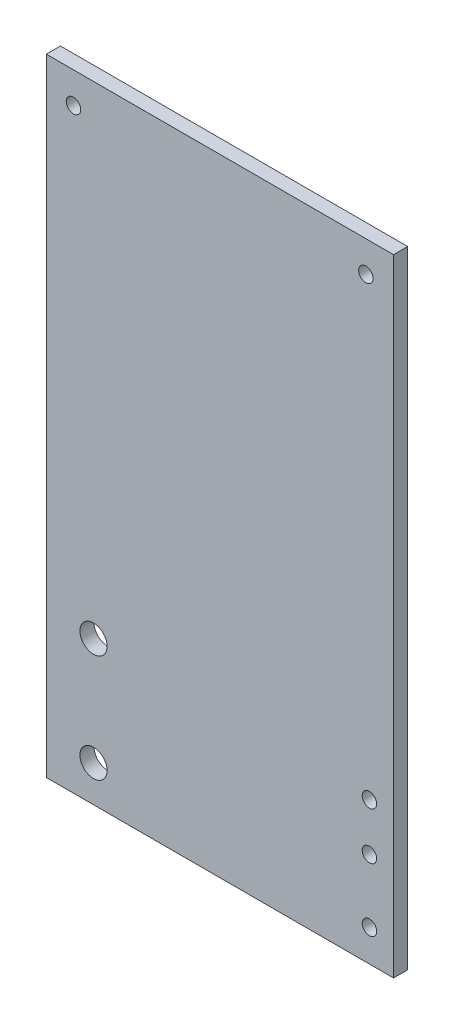
ISO-10303-21;
HEADER;
FILE_DESCRIPTION(('STEP AP214'),'2;1');
FILE_NAME('part.step','',(''),(''),'','','');
FILE_SCHEMA(('AUTOMOTIVE_DESIGN { 1 0 10303 214 1 1 1 1 }'));
ENDSEC;
DATA;
#1=APPLICATION_CONTEXT('core data for automotive mechanical design processes');
#2=APPLICATION_PROTOCOL_DEFINITION('international standard','automotive_design',2000,#1);
#3=PRODUCT_CONTEXT('',#1,'mechanical');
#4=PRODUCT('Part','Part','',(#3));
#5=PRODUCT_RELATED_PRODUCT_CATEGORY('part','',(#4));
#6=PRODUCT_DEFINITION_FORMATION('','',#4);
#7=PRODUCT_DEFINITION_CONTEXT('part definition',#1,'design');
#8=PRODUCT_DEFINITION('design','',#6,#7);
#9=PRODUCT_DEFINITION_SHAPE('','',#8);
#10=(LENGTH_UNIT() NAMED_UNIT(*) SI_UNIT(.MILLI.,.METRE.));
#11=(NAMED_UNIT(*) PLANE_ANGLE_UNIT() SI_UNIT($,.RADIAN.));
#12=(NAMED_UNIT(*) SI_UNIT($,.STERADIAN.) SOLID_ANGLE_UNIT());
#13=UNCERTAINTY_MEASURE_WITH_UNIT(LENGTH_MEASURE(1.E-05),#10,'distance_accuracy_value','');
#14=(GEOMETRIC_REPRESENTATION_CONTEXT(3) GLOBAL_UNCERTAINTY_ASSIGNED_CONTEXT((#13)) GLOBAL_UNIT_ASSIGNED_CONTEXT((#10,
#11,#12)) REPRESENTATION_CONTEXT('',''));
#15=CARTESIAN_POINT('',(0.,0.,0.));
#16=DIRECTION('',(0.,0.,1.));
#17=DIRECTION('',(1.,0.,0.));
#18=AXIS2_PLACEMENT_3D('',#15,#16,#17);
#19=CARTESIAN_POINT('',(19.43,0.,0.79));
#20=DIRECTION('',(0.,1.,0.));
#21=DIRECTION('',(0.,0.,1.));
#22=AXIS2_PLACEMENT_3D('',#19,#20,#21);
#23=PLANE('',#22);
#24=DIRECTION('',(1.,0.,0.));
#25=VECTOR('',#24,1.);
#26=CARTESIAN_POINT('',(19.43,0.,0.));
#27=LINE('',#26,#25);
#28=CARTESIAN_POINT('',(0.,0.,0.));
#29=VERTEX_POINT('',#28);
#30=CARTESIAN_POINT('',(19.43,0.,0.));
#31=VERTEX_POINT('',#30);
#32=EDGE_CURVE('E96',#29,#31,#27,.T.);
#33=ORIENTED_EDGE('',*,*,#32,.T.);
#34=DIRECTION('',(0.,0.,-1.));
#35=VECTOR('',#34,1.);
#36=CARTESIAN_POINT('',(19.43,0.,0.79));
#37=LINE('',#36,#35);
#38=CARTESIAN_POINT('',(19.43,0.,0.79));
#39=VERTEX_POINT('',#38);
#40=EDGE_CURVE('E11',#39,#31,#37,.T.);
#41=ORIENTED_EDGE('',*,*,#40,.F.);
#42=DIRECTION('',(1.,0.,0.));
#43=VECTOR('',#42,1.);
#44=CARTESIAN_POINT('',(19.43,0.,0.79));
#45=LINE('',#44,#43);
#46=CARTESIAN_POINT('',(0.,0.,0.79));
#47=VERTEX_POINT('',#46);
#48=EDGE_CURVE('E84',#47,#39,#45,.T.);
#49=ORIENTED_EDGE('',*,*,#48,.F.);
#50=DIRECTION('',(0.,0.,-1.));
#51=VECTOR('',#50,1.);
#52=CARTESIAN_POINT('',(0.,0.,0.79));
#53=LINE('',#52,#51);
#54=EDGE_CURVE('E92',#47,#29,#53,.T.);
#55=ORIENTED_EDGE('',*,*,#54,.T.);
#56=EDGE_LOOP('',(#33,#41,#49,#55));
#57=FACE_BOUND('',#56,.T.);
#58=ADVANCED_FACE('F33',(#57),#23,.F.);
#59=CARTESIAN_POINT('',(19.43,35.05,0.79));
#60=DIRECTION('',(-1.,0.,0.));
#61=DIRECTION('',(0.,0.,1.));
#62=AXIS2_PLACEMENT_3D('',#59,#60,#61);
#63=PLANE('',#62);
#64=DIRECTION('',(0.,1.,0.));
#65=VECTOR('',#64,1.);
#66=CARTESIAN_POINT('',(19.43,35.05,0.));
#67=LINE('',#66,#65);
#68=CARTESIAN_POINT('',(19.43,35.05,0.));
#69=VERTEX_POINT('',#68);
#70=EDGE_CURVE('E88',#31,#69,#67,.T.);
#71=ORIENTED_EDGE('',*,*,#70,.T.);
#72=DIRECTION('',(0.,0.,-1.));
#73=VECTOR('',#72,1.);
#74=CARTESIAN_POINT('',(19.43,35.05,0.79));
#75=LINE('',#74,#73);
#76=CARTESIAN_POINT('',(19.43,35.05,0.79));
#77=VERTEX_POINT('',#76);
#78=EDGE_CURVE('E41',#77,#69,#75,.T.);
#79=ORIENTED_EDGE('',*,*,#78,.F.);
#80=DIRECTION('',(0.,1.,0.));
#81=VECTOR('',#80,1.);
#82=CARTESIAN_POINT('',(19.43,35.05,0.79));
#83=LINE('',#82,#81);
#84=EDGE_CURVE('E79',#39,#77,#83,.T.);
#85=ORIENTED_EDGE('',*,*,#84,.F.);
#86=ORIENTED_EDGE('',*,*,#40,.T.);
#87=EDGE_LOOP('',(#71,#79,#85,#86));
#88=FACE_BOUND('',#87,.T.);
#89=ADVANCED_FACE('F87',(#88),#63,.F.);
#90=CARTESIAN_POINT('',(0.,35.05,0.79));
#91=DIRECTION('',(0.,-1.,0.));
#92=DIRECTION('',(0.,0.,-1.));
#93=AXIS2_PLACEMENT_3D('',#90,#91,#92);
#94=PLANE('',#93);
#95=DIRECTION('',(-1.,0.,0.));
#96=VECTOR('',#95,1.);
#97=CARTESIAN_POINT('',(0.,35.05,0.));
#98=LINE('',#97,#96);
#99=CARTESIAN_POINT('',(0.,35.05,0.));
#100=VERTEX_POINT('',#99);
#101=EDGE_CURVE('E66',#69,#100,#98,.T.);
#102=ORIENTED_EDGE('',*,*,#101,.T.);
#103=DIRECTION('',(0.,0.,-1.));
#104=VECTOR('',#103,1.);
#105=CARTESIAN_POINT('',(0.,35.05,0.79));
#106=LINE('',#105,#104);
#107=CARTESIAN_POINT('',(0.,35.05,0.79));
#108=VERTEX_POINT('',#107);
#109=EDGE_CURVE('E89',#108,#100,#106,.T.);
#110=ORIENTED_EDGE('',*,*,#109,.F.);
#111=DIRECTION('',(-1.,0.,0.));
#112=VECTOR('',#111,1.);
#113=CARTESIAN_POINT('',(0.,35.05,0.79));
#114=LINE('',#113,#112);
#115=EDGE_CURVE('E82',#77,#108,#114,.T.);
#116=ORIENTED_EDGE('',*,*,#115,.F.);
#117=ORIENTED_EDGE('',*,*,#78,.T.);
#118=EDGE_LOOP('',(#102,#110,#116,#117));
#119=FACE_BOUND('',#118,.T.);
#120=ADVANCED_FACE('F90',(#119),#94,.F.);
#121=CARTESIAN_POINT('',(0.,0.,0.79));
#122=DIRECTION('',(1.,0.,0.));
#123=DIRECTION('',(0.,0.,-1.));
#124=AXIS2_PLACEMENT_3D('',#121,#122,#123);
#125=PLANE('',#124);
#126=DIRECTION('',(0.,-1.,0.));
#127=VECTOR('',#126,1.);
#128=CARTESIAN_POINT('',(0.,0.,0.));
#129=LINE('',#128,#127);
#130=EDGE_CURVE('E72',#100,#29,#129,.T.);
#131=ORIENTED_EDGE('',*,*,#130,.T.);
#132=ORIENTED_EDGE('',*,*,#54,.F.);
#133=DIRECTION('',(0.,-1.,0.));
#134=VECTOR('',#133,1.);
#135=CARTESIAN_POINT('',(0.,0.,0.79));
#136=LINE('',#135,#134);
#137=EDGE_CURVE('E49',#108,#47,#136,.T.);
#138=ORIENTED_EDGE('',*,*,#137,.F.);
#139=ORIENTED_EDGE('',*,*,#109,.T.);
#140=EDGE_LOOP('',(#131,#132,#138,#139));
#141=FACE_BOUND('',#140,.T.);
#142=ADVANCED_FACE('F104',(#141),#125,.F.);
#143=CARTESIAN_POINT('',(0.,0.,0.79));
#144=DIRECTION('',(0.,0.,-1.));
#145=DIRECTION('',(-1.,0.,0.));
#146=AXIS2_PLACEMENT_3D('',#143,#144,#145);
#147=PLANE('',#146);
#148=CARTESIAN_POINT('',(18.08,1.78,0.79));
#149=DIRECTION('',(0.,0.,1.));
#150=DIRECTION('',(1.,0.,0.));
#151=AXIS2_PLACEMENT_3D('',#148,#149,#150);
#152=CIRCLE('',#151,0.404999999999999);
#153=CARTESIAN_POINT('',(18.485,1.78,0.79));
#154=VERTEX_POINT('',#153);
#155=EDGE_CURVE('E143',#154,#154,#152,.T.);
#156=ORIENTED_EDGE('',*,*,#155,.F.);
#157=EDGE_LOOP('',(#156));
#158=FACE_BOUND('',#157,.T.);
#159=CARTESIAN_POINT('',(1.52,33.32,0.79));
#160=DIRECTION('',(0.,0.,1.));
#161=DIRECTION('',(1.,0.,0.));
#162=AXIS2_PLACEMENT_3D('',#159,#160,#161);
#163=CIRCLE('',#162,0.405);
#164=CARTESIAN_POINT('',(1.925,33.32,0.79));
#165=VERTEX_POINT('',#164);
#166=EDGE_CURVE('E137',#165,#165,#163,.T.);
#167=ORIENTED_EDGE('',*,*,#166,.F.);
#168=EDGE_LOOP('',(#167));
#169=FACE_BOUND('',#168,.T.);
#170=CARTESIAN_POINT('',(18.08,7.96,0.79));
#171=DIRECTION('',(0.,0.,1.));
#172=DIRECTION('',(1.,0.,0.));
#173=AXIS2_PLACEMENT_3D('',#170,#171,#172);
#174=CIRCLE('',#173,0.404999999999999);
#175=CARTESIAN_POINT('',(18.485,7.96,0.79));
#176=VERTEX_POINT('',#175);
#177=EDGE_CURVE('E131',#176,#176,#174,.T.);
#178=ORIENTED_EDGE('',*,*,#177,.F.);
#179=EDGE_LOOP('',(#178));
#180=FACE_BOUND('',#179,.T.);
#181=CARTESIAN_POINT('',(2.64,2.03,0.79));
#182=DIRECTION('',(0.,0.,1.));
#183=DIRECTION('',(1.,0.,0.));
#184=AXIS2_PLACEMENT_3D('',#181,#182,#183);
#185=CIRCLE('',#184,0.76);
#186=CARTESIAN_POINT('',(1.88,2.03,0.79));
#187=VERTEX_POINT('',#186);
#188=EDGE_CURVE('E125',#187,#187,#185,.T.);
#189=ORIENTED_EDGE('',*,*,#188,.F.);
#190=EDGE_LOOP('',(#189));
#191=FACE_BOUND('',#190,.T.);
#192=CARTESIAN_POINT('',(2.64,8.05,0.79));
#193=DIRECTION('',(0.,0.,1.));
#194=DIRECTION('',(1.,0.,0.));
#195=AXIS2_PLACEMENT_3D('',#192,#193,#194);
#196=CIRCLE('',#195,0.76);
#197=CARTESIAN_POINT('',(1.88,8.05,0.79));
#198=VERTEX_POINT('',#197);
#199=EDGE_CURVE('E119',#198,#198,#196,.T.);
#200=ORIENTED_EDGE('',*,*,#199,.F.);
#201=EDGE_LOOP('',(#200));
#202=FACE_BOUND('',#201,.T.);
#203=CARTESIAN_POINT('',(17.88,33.32,0.79));
#204=DIRECTION('',(0.,0.,1.));
#205=DIRECTION('',(1.,0.,0.));
#206=AXIS2_PLACEMENT_3D('',#203,#204,#205);
#207=CIRCLE('',#206,0.404999999999999);
#208=CARTESIAN_POINT('',(18.285,33.32,0.79));
#209=VERTEX_POINT('',#208);
#210=EDGE_CURVE('E113',#209,#209,#207,.T.);
#211=ORIENTED_EDGE('',*,*,#210,.F.);
#212=EDGE_LOOP('',(#211));
#213=FACE_BOUND('',#212,.T.);
#214=CARTESIAN_POINT('',(18.08,5.31,0.79));
#215=DIRECTION('',(0.,0.,1.));
#216=DIRECTION('',(1.,0.,0.));
#217=AXIS2_PLACEMENT_3D('',#214,#215,#216);
#218=CIRCLE('',#217,0.404999999999999);
#219=CARTESIAN_POINT('',(18.485,5.31,0.79));
#220=VERTEX_POINT('',#219);
#221=EDGE_CURVE('E99',#220,#220,#218,.T.);
#222=ORIENTED_EDGE('',*,*,#221,.F.);
#223=EDGE_LOOP('',(#222));
#224=FACE_BOUND('',#223,.T.);
#225=ORIENTED_EDGE('',*,*,#48,.T.);
#226=ORIENTED_EDGE('',*,*,#84,.T.);
#227=ORIENTED_EDGE('',*,*,#115,.T.);
#228=ORIENTED_EDGE('',*,*,#137,.T.);
#229=EDGE_LOOP('',(#225,#226,#227,#228));
#230=FACE_BOUND('',#229,.T.);
#231=ADVANCED_FACE('F80',(#158,#169,#180,#191,#202,#213,#224,#230),#147,.F.);
#232=CARTESIAN_POINT('',(0.,0.,0.));
#233=DIRECTION('',(0.,0.,-1.));
#234=DIRECTION('',(-1.,0.,0.));
#235=AXIS2_PLACEMENT_3D('',#232,#233,#234);
#236=PLANE('',#235);
#237=CARTESIAN_POINT('',(18.08,1.78,0.));
#238=DIRECTION('',(0.,0.,1.));
#239=DIRECTION('',(1.,0.,0.));
#240=AXIS2_PLACEMENT_3D('',#237,#238,#239);
#241=CIRCLE('',#240,0.404999999999999);
#242=CARTESIAN_POINT('',(18.485,1.78,0.));
#243=VERTEX_POINT('',#242);
#244=EDGE_CURVE('E146',#243,#243,#241,.T.);
#245=ORIENTED_EDGE('',*,*,#244,.T.);
#246=EDGE_LOOP('',(#245));
#247=FACE_BOUND('',#246,.T.);
#248=CARTESIAN_POINT('',(1.52,33.32,0.));
#249=DIRECTION('',(0.,0.,1.));
#250=DIRECTION('',(1.,0.,0.));
#251=AXIS2_PLACEMENT_3D('',#248,#249,#250);
#252=CIRCLE('',#251,0.405);
#253=CARTESIAN_POINT('',(1.925,33.32,0.));
#254=VERTEX_POINT('',#253);
#255=EDGE_CURVE('E140',#254,#254,#252,.T.);
#256=ORIENTED_EDGE('',*,*,#255,.T.);
#257=EDGE_LOOP('',(#256));
#258=FACE_BOUND('',#257,.T.);
#259=CARTESIAN_POINT('',(18.08,7.96,0.));
#260=DIRECTION('',(0.,0.,1.));
#261=DIRECTION('',(1.,0.,0.));
#262=AXIS2_PLACEMENT_3D('',#259,#260,#261);
#263=CIRCLE('',#262,0.404999999999999);
#264=CARTESIAN_POINT('',(18.485,7.96,0.));
#265=VERTEX_POINT('',#264);
#266=EDGE_CURVE('E134',#265,#265,#263,.T.);
#267=ORIENTED_EDGE('',*,*,#266,.T.);
#268=EDGE_LOOP('',(#267));
#269=FACE_BOUND('',#268,.T.);
#270=CARTESIAN_POINT('',(2.64,2.03,0.));
#271=DIRECTION('',(0.,0.,1.));
#272=DIRECTION('',(1.,0.,0.));
#273=AXIS2_PLACEMENT_3D('',#270,#271,#272);
#274=CIRCLE('',#273,0.76);
#275=CARTESIAN_POINT('',(1.88,2.03,0.));
#276=VERTEX_POINT('',#275);
#277=EDGE_CURVE('E128',#276,#276,#274,.T.);
#278=ORIENTED_EDGE('',*,*,#277,.T.);
#279=EDGE_LOOP('',(#278));
#280=FACE_BOUND('',#279,.T.);
#281=CARTESIAN_POINT('',(2.64,8.05,0.));
#282=DIRECTION('',(0.,0.,1.));
#283=DIRECTION('',(1.,0.,0.));
#284=AXIS2_PLACEMENT_3D('',#281,#282,#283);
#285=CIRCLE('',#284,0.76);
#286=CARTESIAN_POINT('',(1.88,8.05,0.));
#287=VERTEX_POINT('',#286);
#288=EDGE_CURVE('E122',#287,#287,#285,.T.);
#289=ORIENTED_EDGE('',*,*,#288,.T.);
#290=EDGE_LOOP('',(#289));
#291=FACE_BOUND('',#290,.T.);
#292=CARTESIAN_POINT('',(17.88,33.32,0.));
#293=DIRECTION('',(0.,0.,1.));
#294=DIRECTION('',(1.,0.,0.));
#295=AXIS2_PLACEMENT_3D('',#292,#293,#294);
#296=CIRCLE('',#295,0.404999999999999);
#297=CARTESIAN_POINT('',(18.285,33.32,0.));
#298=VERTEX_POINT('',#297);
#299=EDGE_CURVE('E116',#298,#298,#296,.T.);
#300=ORIENTED_EDGE('',*,*,#299,.T.);
#301=EDGE_LOOP('',(#300));
#302=FACE_BOUND('',#301,.T.);
#303=CARTESIAN_POINT('',(18.08,5.31,0.));
#304=DIRECTION('',(0.,0.,1.));
#305=DIRECTION('',(1.,0.,0.));
#306=AXIS2_PLACEMENT_3D('',#303,#304,#305);
#307=CIRCLE('',#306,0.404999999999999);
#308=CARTESIAN_POINT('',(18.485,5.31,0.));
#309=VERTEX_POINT('',#308);
#310=EDGE_CURVE('E110',#309,#309,#307,.T.);
#311=ORIENTED_EDGE('',*,*,#310,.T.);
#312=EDGE_LOOP('',(#311));
#313=FACE_BOUND('',#312,.T.);
#314=ORIENTED_EDGE('',*,*,#32,.F.);
#315=ORIENTED_EDGE('',*,*,#130,.F.);
#316=ORIENTED_EDGE('',*,*,#101,.F.);
#317=ORIENTED_EDGE('',*,*,#70,.F.);
#318=EDGE_LOOP('',(#314,#315,#316,#317));
#319=FACE_BOUND('',#318,.T.);
#320=ADVANCED_FACE('F107',(#247,#258,#269,#280,#291,#302,#313,#319),#236,.T.);
#321=CARTESIAN_POINT('',(18.08,5.31,0.79));
#322=DIRECTION('',(0.,0.,-1.));
#323=DIRECTION('',(-1.,0.,0.));
#324=AXIS2_PLACEMENT_3D('',#321,#322,#323);
#325=CYLINDRICAL_SURFACE('',#324,0.404999999999999);
#326=ORIENTED_EDGE('',*,*,#221,.T.);
#327=EDGE_LOOP('',(#326));
#328=FACE_BOUND('',#327,.T.);
#329=ORIENTED_EDGE('',*,*,#310,.F.);
#330=EDGE_LOOP('',(#329));
#331=FACE_BOUND('',#330,.T.);
#332=ADVANCED_FACE('F170',(#328,#331),#325,.F.);
#333=CARTESIAN_POINT('',(17.88,33.32,0.79));
#334=DIRECTION('',(0.,0.,-1.));
#335=DIRECTION('',(-1.,0.,0.));
#336=AXIS2_PLACEMENT_3D('',#333,#334,#335);
#337=CYLINDRICAL_SURFACE('',#336,0.404999999999999);
#338=ORIENTED_EDGE('',*,*,#210,.T.);
#339=EDGE_LOOP('',(#338));
#340=FACE_BOUND('',#339,.T.);
#341=ORIENTED_EDGE('',*,*,#299,.F.);
#342=EDGE_LOOP('',(#341));
#343=FACE_BOUND('',#342,.T.);
#344=ADVANCED_FACE('F173',(#340,#343),#337,.F.);
#345=CARTESIAN_POINT('',(2.64,8.05,0.79));
#346=DIRECTION('',(0.,0.,-1.));
#347=DIRECTION('',(-1.,0.,0.));
#348=AXIS2_PLACEMENT_3D('',#345,#346,#347);
#349=CYLINDRICAL_SURFACE('',#348,0.76);
#350=CARTESIAN_POINT('',(1.88,8.05,0.79));
#351=CARTESIAN_POINT('',(1.88,8.05,0.781770833333333));
#352=CARTESIAN_POINT('',(1.88,8.05,0.773541666666667));
#353=CARTESIAN_POINT('',(1.88,8.05,0.757083333333333));
#354=CARTESIAN_POINT('',(1.88,8.05,0.748854166666667));
#355=CARTESIAN_POINT('',(1.88,8.05,0.732395833333333));
#356=CARTESIAN_POINT('',(1.88,8.05,0.724166666666667));
#357=CARTESIAN_POINT('',(1.88,8.05,0.707708333333333));
#358=CARTESIAN_POINT('',(1.88,8.05,0.699479166666667));
#359=CARTESIAN_POINT('',(1.88,8.05,0.683020833333333));
#360=CARTESIAN_POINT('',(1.88,8.05,0.674791666666667));
#361=CARTESIAN_POINT('',(1.88,8.05,0.658333333333333));
#362=CARTESIAN_POINT('',(1.88,8.05,0.650104166666667));
#363=CARTESIAN_POINT('',(1.88,8.05,0.633645833333333));
#364=CARTESIAN_POINT('',(1.88,8.05,0.625416666666667));
#365=CARTESIAN_POINT('',(1.88,8.05,0.608958333333333));
#366=CARTESIAN_POINT('',(1.88,8.05,0.600729166666667));
#367=CARTESIAN_POINT('',(1.88,8.05,0.584270833333333));
#368=CARTESIAN_POINT('',(1.88,8.05,0.576041666666667));
#369=CARTESIAN_POINT('',(1.88,8.05,0.559583333333333));
#370=CARTESIAN_POINT('',(1.88,8.05,0.551354166666667));
#371=CARTESIAN_POINT('',(1.88,8.05,0.534895833333333));
#372=CARTESIAN_POINT('',(1.88,8.05,0.526666666666667));
#373=CARTESIAN_POINT('',(1.88,8.05,0.510208333333333));
#374=CARTESIAN_POINT('',(1.88,8.05,0.501979166666667));
#375=CARTESIAN_POINT('',(1.88,8.05,0.485520833333333));
#376=CARTESIAN_POINT('',(1.88,8.05,0.477291666666667));
#377=CARTESIAN_POINT('',(1.88,8.05,0.460833333333333));
#378=CARTESIAN_POINT('',(1.88,8.05,0.452604166666667));
#379=CARTESIAN_POINT('',(1.88,8.05,0.436145833333333));
#380=CARTESIAN_POINT('',(1.88,8.05,0.427916666666667));
#381=CARTESIAN_POINT('',(1.88,8.05,0.411458333333333));
#382=CARTESIAN_POINT('',(1.88,8.05,0.403229166666667));
#383=CARTESIAN_POINT('',(1.88,8.05,0.386770833333333));
#384=CARTESIAN_POINT('',(1.88,8.05,0.378541666666667));
#385=CARTESIAN_POINT('',(1.88,8.05,0.362083333333333));
#386=CARTESIAN_POINT('',(1.88,8.05,0.353854166666667));
#387=CARTESIAN_POINT('',(1.88,8.05,0.337395833333333));
#388=CARTESIAN_POINT('',(1.88,8.05,0.329166666666667));
#389=CARTESIAN_POINT('',(1.88,8.05,0.312708333333333));
#390=CARTESIAN_POINT('',(1.88,8.05,0.304479166666667));
#391=CARTESIAN_POINT('',(1.88,8.05,0.288020833333333));
#392=CARTESIAN_POINT('',(1.88,8.05,0.279791666666667));
#393=CARTESIAN_POINT('',(1.88,8.05,0.263333333333333));
#394=CARTESIAN_POINT('',(1.88,8.05,0.255104166666667));
#395=CARTESIAN_POINT('',(1.88,8.05,0.238645833333333));
#396=CARTESIAN_POINT('',(1.88,8.05,0.230416666666667));
#397=CARTESIAN_POINT('',(1.88,8.05,0.213958333333333));
#398=CARTESIAN_POINT('',(1.88,8.05,0.205729166666667));
#399=CARTESIAN_POINT('',(1.88,8.05,0.189270833333333));
#400=CARTESIAN_POINT('',(1.88,8.05,0.181041666666667));
#401=CARTESIAN_POINT('',(1.88,8.05,0.164583333333333));
#402=CARTESIAN_POINT('',(1.88,8.05,0.156354166666667));
#403=CARTESIAN_POINT('',(1.88,8.05,0.139895833333333));
#404=CARTESIAN_POINT('',(1.88,8.05,0.131666666666667));
#405=CARTESIAN_POINT('',(1.88,8.05,0.115208333333333));
#406=CARTESIAN_POINT('',(1.88,8.05,0.106979166666667));
#407=CARTESIAN_POINT('',(1.88,8.05,0.0905208333333333));
#408=CARTESIAN_POINT('',(1.88,8.05,0.0822916666666667));
#409=CARTESIAN_POINT('',(1.88,8.05,0.0658333333333334));
#410=CARTESIAN_POINT('',(1.88,8.05,0.0576041666666667));
#411=CARTESIAN_POINT('',(1.88,8.05,0.0411458333333334));
#412=CARTESIAN_POINT('',(1.88,8.05,0.0329166666666667));
#413=CARTESIAN_POINT('',(1.88,8.05,0.0164583333333333));
#414=CARTESIAN_POINT('',(1.88,8.05,0.00822916666666665));
#415=CARTESIAN_POINT('',(1.88,8.05,0.));
#416=B_SPLINE_CURVE_WITH_KNOTS('',3,(#350,#351,#352,#353,#354,#355,#356,#357,#358,#359,#360,
#361,#362,#363,#364,#365,#366,#367,#368,#369,#370,#371,#372,#373,#374,#375,#376,#377,#378,#379,
#380,#381,#382,#383,#384,#385,#386,#387,#388,#389,#390,#391,#392,#393,#394,#395,#396,#397,#398,
#399,#400,#401,#402,#403,#404,#405,#406,#407,#408,#409,#410,#411,#412,#413,#414,#415),
.UNSPECIFIED.,.F.,.F.,(4,2,2,2,2,2,2,2,2,2,2,2,2,2,2,2,2,2,2,2,2,2,2,2,2,2,2,2,2,2,2,2,4),(0.,
0.0246875000000001,0.0493750000000001,0.0740625,0.0987500000000001,0.1234375,0.148125,0.1728125,
0.1975,0.2221875,0.246875,0.2715625,0.29625,0.3209375,0.345625,0.3703125,0.395,0.4196875,
0.444375,0.4690625,0.49375,0.5184375,0.543125,0.5678125,0.5925,0.6171875,0.641875,0.6665625,
0.69125,0.7159375,0.740625,0.7653125,0.79),.UNSPECIFIED.);
#417=EDGE_CURVE('BSEAM220',#198,#287,#416,.T.);
#418=ORIENTED_EDGE('',*,*,#199,.T.);
#419=ORIENTED_EDGE('',*,*,#288,.F.);
#420=ORIENTED_EDGE('',*,*,#417,.T.);
#421=ORIENTED_EDGE('',*,*,#417,.F.);
#422=EDGE_LOOP('',(#418,#420,#419,#421));
#423=FACE_BOUND('',#422,.T.);
#424=ADVANCED_FACE('F220',(#423),#349,.F.);
#425=CARTESIAN_POINT('',(2.64,2.03,0.79));
#426=DIRECTION('',(0.,0.,-1.));
#427=DIRECTION('',(-1.,0.,0.));
#428=AXIS2_PLACEMENT_3D('',#425,#426,#427);
#429=CYLINDRICAL_SURFACE('',#428,0.76);
#430=CARTESIAN_POINT('',(1.88,2.03,0.79));
#431=CARTESIAN_POINT('',(1.88,2.03,0.781770833333333));
#432=CARTESIAN_POINT('',(1.88,2.03,0.773541666666667));
#433=CARTESIAN_POINT('',(1.88,2.03,0.757083333333333));
#434=CARTESIAN_POINT('',(1.88,2.03,0.748854166666667));
#435=CARTESIAN_POINT('',(1.88,2.03,0.732395833333333));
#436=CARTESIAN_POINT('',(1.88,2.03,0.724166666666667));
#437=CARTESIAN_POINT('',(1.88,2.03,0.707708333333333));
#438=CARTESIAN_POINT('',(1.88,2.03,0.699479166666667));
#439=CARTESIAN_POINT('',(1.88,2.03,0.683020833333333));
#440=CARTESIAN_POINT('',(1.88,2.03,0.674791666666667));
#441=CARTESIAN_POINT('',(1.88,2.03,0.658333333333333));
#442=CARTESIAN_POINT('',(1.88,2.03,0.650104166666667));
#443=CARTESIAN_POINT('',(1.88,2.03,0.633645833333333));
#444=CARTESIAN_POINT('',(1.88,2.03,0.625416666666667));
#445=CARTESIAN_POINT('',(1.88,2.03,0.608958333333333));
#446=CARTESIAN_POINT('',(1.88,2.03,0.600729166666667));
#447=CARTESIAN_POINT('',(1.88,2.03,0.584270833333333));
#448=CARTESIAN_POINT('',(1.88,2.03,0.576041666666667));
#449=CARTESIAN_POINT('',(1.88,2.03,0.559583333333333));
#450=CARTESIAN_POINT('',(1.88,2.03,0.551354166666667));
#451=CARTESIAN_POINT('',(1.88,2.03,0.534895833333333));
#452=CARTESIAN_POINT('',(1.88,2.03,0.526666666666667));
#453=CARTESIAN_POINT('',(1.88,2.03,0.510208333333333));
#454=CARTESIAN_POINT('',(1.88,2.03,0.501979166666667));
#455=CARTESIAN_POINT('',(1.88,2.03,0.485520833333333));
#456=CARTESIAN_POINT('',(1.88,2.03,0.477291666666667));
#457=CARTESIAN_POINT('',(1.88,2.03,0.460833333333333));
#458=CARTESIAN_POINT('',(1.88,2.03,0.452604166666667));
#459=CARTESIAN_POINT('',(1.88,2.03,0.436145833333333));
#460=CARTESIAN_POINT('',(1.88,2.03,0.427916666666667));
#461=CARTESIAN_POINT('',(1.88,2.03,0.411458333333333));
#462=CARTESIAN_POINT('',(1.88,2.03,0.403229166666667));
#463=CARTESIAN_POINT('',(1.88,2.03,0.386770833333333));
#464=CARTESIAN_POINT('',(1.88,2.03,0.378541666666667));
#465=CARTESIAN_POINT('',(1.88,2.03,0.362083333333333));
#466=CARTESIAN_POINT('',(1.88,2.03,0.353854166666667));
#467=CARTESIAN_POINT('',(1.88,2.03,0.337395833333333));
#468=CARTESIAN_POINT('',(1.88,2.03,0.329166666666667));
#469=CARTESIAN_POINT('',(1.88,2.03,0.312708333333333));
#470=CARTESIAN_POINT('',(1.88,2.03,0.304479166666667));
#471=CARTESIAN_POINT('',(1.88,2.03,0.288020833333333));
#472=CARTESIAN_POINT('',(1.88,2.03,0.279791666666667));
#473=CARTESIAN_POINT('',(1.88,2.03,0.263333333333333));
#474=CARTESIAN_POINT('',(1.88,2.03,0.255104166666667));
#475=CARTESIAN_POINT('',(1.88,2.03,0.238645833333333));
#476=CARTESIAN_POINT('',(1.88,2.03,0.230416666666667));
#477=CARTESIAN_POINT('',(1.88,2.03,0.213958333333333));
#478=CARTESIAN_POINT('',(1.88,2.03,0.205729166666667));
#479=CARTESIAN_POINT('',(1.88,2.03,0.189270833333333));
#480=CARTESIAN_POINT('',(1.88,2.03,0.181041666666667));
#481=CARTESIAN_POINT('',(1.88,2.03,0.164583333333333));
#482=CARTESIAN_POINT('',(1.88,2.03,0.156354166666667));
#483=CARTESIAN_POINT('',(1.88,2.03,0.139895833333333));
#484=CARTESIAN_POINT('',(1.88,2.03,0.131666666666667));
#485=CARTESIAN_POINT('',(1.88,2.03,0.115208333333333));
#486=CARTESIAN_POINT('',(1.88,2.03,0.106979166666667));
#487=CARTESIAN_POINT('',(1.88,2.03,0.0905208333333333));
#488=CARTESIAN_POINT('',(1.88,2.03,0.0822916666666667));
#489=CARTESIAN_POINT('',(1.88,2.03,0.0658333333333334));
#490=CARTESIAN_POINT('',(1.88,2.03,0.0576041666666667));
#491=CARTESIAN_POINT('',(1.88,2.03,0.0411458333333334));
#492=CARTESIAN_POINT('',(1.88,2.03,0.0329166666666667));
#493=CARTESIAN_POINT('',(1.88,2.03,0.0164583333333333));
#494=CARTESIAN_POINT('',(1.88,2.03,0.00822916666666665));
#495=CARTESIAN_POINT('',(1.88,2.03,0.));
#496=B_SPLINE_CURVE_WITH_KNOTS('',3,(#430,#431,#432,#433,#434,#435,#436,#437,#438,#439,#440,
#441,#442,#443,#444,#445,#446,#447,#448,#449,#450,#451,#452,#453,#454,#455,#456,#457,#458,#459,
#460,#461,#462,#463,#464,#465,#466,#467,#468,#469,#470,#471,#472,#473,#474,#475,#476,#477,#478,
#479,#480,#481,#482,#483,#484,#485,#486,#487,#488,#489,#490,#491,#492,#493,#494,#495),
.UNSPECIFIED.,.F.,.F.,(4,2,2,2,2,2,2,2,2,2,2,2,2,2,2,2,2,2,2,2,2,2,2,2,2,2,2,2,2,2,2,2,4),(0.,
0.0246875000000001,0.0493750000000001,0.0740625,0.0987500000000001,0.1234375,0.148125,0.1728125,
0.1975,0.2221875,0.246875,0.2715625,0.29625,0.3209375,0.345625,0.3703125,0.395,0.4196875,
0.444375,0.4690625,0.49375,0.5184375,0.543125,0.5678125,0.5925,0.6171875,0.641875,0.6665625,
0.69125,0.7159375,0.740625,0.7653125,0.79),.UNSPECIFIED.);
#497=EDGE_CURVE('BSEAM230',#187,#276,#496,.T.);
#498=ORIENTED_EDGE('',*,*,#188,.T.);
#499=ORIENTED_EDGE('',*,*,#277,.F.);
#500=ORIENTED_EDGE('',*,*,#497,.T.);
#501=ORIENTED_EDGE('',*,*,#497,.F.);
#502=EDGE_LOOP('',(#498,#500,#499,#501));
#503=FACE_BOUND('',#502,.T.);
#504=ADVANCED_FACE('F230',(#503),#429,.F.);
#505=CARTESIAN_POINT('',(18.08,7.96,0.79));
#506=DIRECTION('',(0.,0.,-1.));
#507=DIRECTION('',(-1.,0.,0.));
#508=AXIS2_PLACEMENT_3D('',#505,#506,#507);
#509=CYLINDRICAL_SURFACE('',#508,0.404999999999999);
#510=ORIENTED_EDGE('',*,*,#177,.T.);
#511=EDGE_LOOP('',(#510));
#512=FACE_BOUND('',#511,.T.);
#513=ORIENTED_EDGE('',*,*,#266,.F.);
#514=EDGE_LOOP('',(#513));
#515=FACE_BOUND('',#514,.T.);
#516=ADVANCED_FACE('F240',(#512,#515),#509,.F.);
#517=CARTESIAN_POINT('',(1.52,33.32,0.79));
#518=DIRECTION('',(0.,0.,-1.));
#519=DIRECTION('',(-1.,0.,0.));
#520=AXIS2_PLACEMENT_3D('',#517,#518,#519);
#521=CYLINDRICAL_SURFACE('',#520,0.405);
#522=ORIENTED_EDGE('',*,*,#166,.T.);
#523=EDGE_LOOP('',(#522));
#524=FACE_BOUND('',#523,.T.);
#525=ORIENTED_EDGE('',*,*,#255,.F.);
#526=EDGE_LOOP('',(#525));
#527=FACE_BOUND('',#526,.T.);
#528=ADVANCED_FACE('F250',(#524,#527),#521,.F.);
#529=CARTESIAN_POINT('',(18.08,1.78,0.79));
#530=DIRECTION('',(0.,0.,-1.));
#531=DIRECTION('',(-1.,0.,0.));
#532=AXIS2_PLACEMENT_3D('',#529,#530,#531);
#533=CYLINDRICAL_SURFACE('',#532,0.404999999999999);
#534=ORIENTED_EDGE('',*,*,#155,.T.);
#535=EDGE_LOOP('',(#534));
#536=FACE_BOUND('',#535,.T.);
#537=ORIENTED_EDGE('',*,*,#244,.F.);
#538=EDGE_LOOP('',(#537));
#539=FACE_BOUND('',#538,.T.);
#540=ADVANCED_FACE('F152',(#536,#539),#533,.F.);
#541=CLOSED_SHELL('',(#58,#89,#120,#142,#231,#320,#332,#344,#424,#504,#516,#528,#540));
#542=MANIFOLD_SOLID_BREP('B2',#541);
#543=ADVANCED_BREP_SHAPE_REPRESENTATION('',(#18,#542),#14);
#544=SHAPE_DEFINITION_REPRESENTATION(#9,#543);
ENDSEC;
END-ISO-10303-21;
